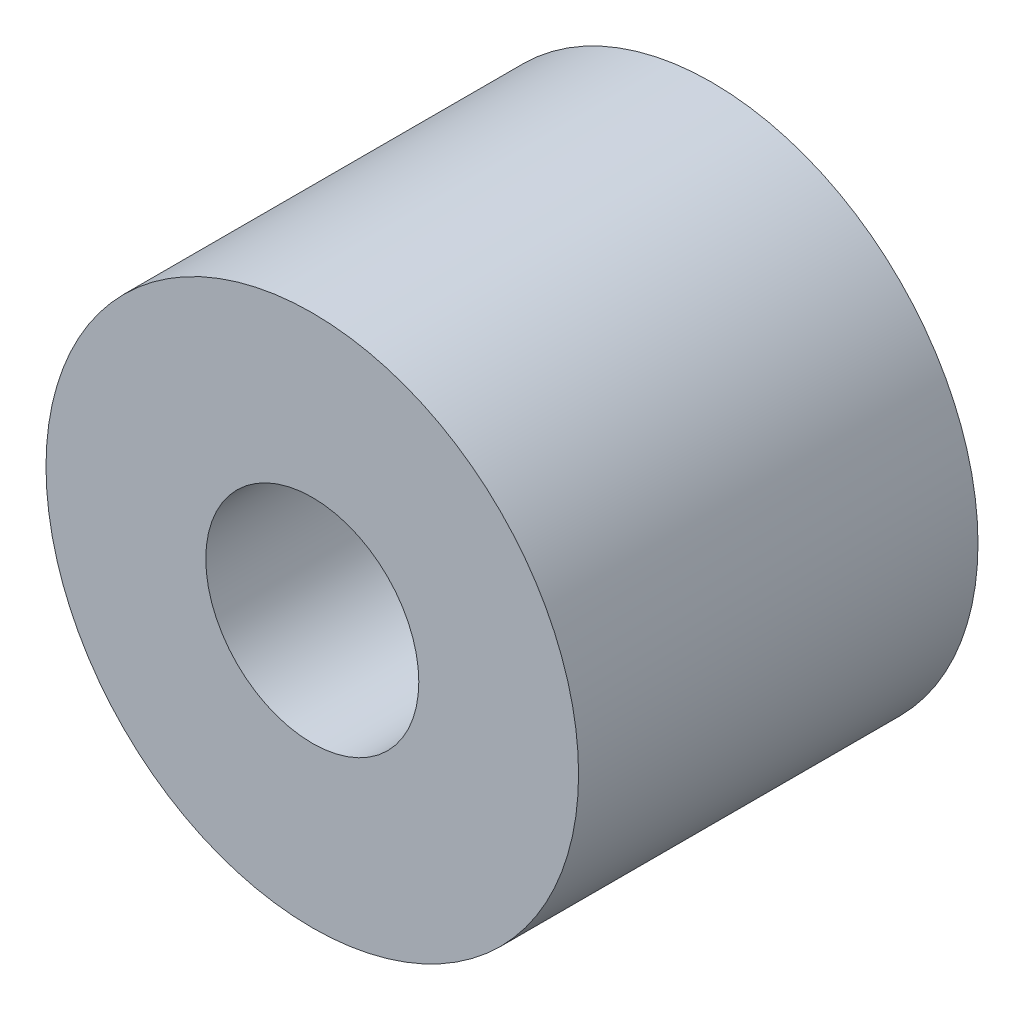
ISO-10303-21;
HEADER;
FILE_DESCRIPTION(('STEP AP214'),'2;1');
FILE_NAME('part.step','',(''),(''),'','','');
FILE_SCHEMA(('AUTOMOTIVE_DESIGN { 1 0 10303 214 1 1 1 1 }'));
ENDSEC;
DATA;
#1=APPLICATION_CONTEXT('core data for automotive mechanical design processes');
#2=APPLICATION_PROTOCOL_DEFINITION('international standard','automotive_design',2000,#1);
#3=PRODUCT_CONTEXT('',#1,'mechanical');
#4=PRODUCT('Part','Part','',(#3));
#5=PRODUCT_RELATED_PRODUCT_CATEGORY('part','',(#4));
#6=PRODUCT_DEFINITION_FORMATION('','',#4);
#7=PRODUCT_DEFINITION_CONTEXT('part definition',#1,'design');
#8=PRODUCT_DEFINITION('design','',#6,#7);
#9=PRODUCT_DEFINITION_SHAPE('','',#8);
#10=(LENGTH_UNIT() NAMED_UNIT(*) SI_UNIT(.MILLI.,.METRE.));
#11=(NAMED_UNIT(*) PLANE_ANGLE_UNIT() SI_UNIT($,.RADIAN.));
#12=(NAMED_UNIT(*) SI_UNIT($,.STERADIAN.) SOLID_ANGLE_UNIT());
#13=UNCERTAINTY_MEASURE_WITH_UNIT(LENGTH_MEASURE(1.E-05),#10,'distance_accuracy_value','');
#14=(GEOMETRIC_REPRESENTATION_CONTEXT(3) GLOBAL_UNCERTAINTY_ASSIGNED_CONTEXT((#13)) GLOBAL_UNIT_ASSIGNED_CONTEXT((#10,
#11,#12)) REPRESENTATION_CONTEXT('',''));
#15=CARTESIAN_POINT('',(0.,0.,0.));
#16=DIRECTION('',(0.,0.,1.));
#17=DIRECTION('',(1.,0.,0.));
#18=AXIS2_PLACEMENT_3D('',#15,#16,#17);
#19=CARTESIAN_POINT('',(0.,0.,15.));
#20=DIRECTION('',(0.,0.,-1.));
#21=DIRECTION('',(-1.,0.,0.));
#22=AXIS2_PLACEMENT_3D('',#19,#20,#21);
#23=CYLINDRICAL_SURFACE('',#22,10.);
#24=CARTESIAN_POINT('',(0.,0.,15.));
#25=DIRECTION('',(0.,0.,1.));
#26=DIRECTION('',(1.,0.,0.));
#27=AXIS2_PLACEMENT_3D('',#24,#25,#26);
#28=CIRCLE('',#27,10.);
#29=CARTESIAN_POINT('',(10.,0.,15.));
#30=VERTEX_POINT('',#29);
#31=EDGE_CURVE('E10',#30,#30,#28,.T.);
#32=ORIENTED_EDGE('',*,*,#31,.F.);
#33=EDGE_LOOP('',(#32));
#34=FACE_BOUND('',#33,.T.);
#35=CARTESIAN_POINT('',(0.,0.,0.));
#36=DIRECTION('',(0.,0.,1.));
#37=DIRECTION('',(1.,0.,0.));
#38=AXIS2_PLACEMENT_3D('',#35,#36,#37);
#39=CIRCLE('',#38,10.);
#40=CARTESIAN_POINT('',(10.,0.,0.));
#41=VERTEX_POINT('',#40);
#42=EDGE_CURVE('E46',#41,#41,#39,.T.);
#43=ORIENTED_EDGE('',*,*,#42,.T.);
#44=EDGE_LOOP('',(#43));
#45=FACE_BOUND('',#44,.T.);
#46=ADVANCED_FACE('F43',(#34,#45),#23,.T.);
#47=CARTESIAN_POINT('',(0.,0.,15.));
#48=DIRECTION('',(0.,0.,1.));
#49=DIRECTION('',(1.,0.,0.));
#50=AXIS2_PLACEMENT_3D('',#47,#48,#49);
#51=PLANE('',#50);
#52=CARTESIAN_POINT('',(0.,0.,15.));
#53=DIRECTION('',(0.,0.,1.));
#54=DIRECTION('',(1.,0.,0.));
#55=AXIS2_PLACEMENT_3D('',#52,#53,#54);
#56=CIRCLE('',#55,4.);
#57=CARTESIAN_POINT('',(4.,0.,15.));
#58=VERTEX_POINT('',#57);
#59=EDGE_CURVE('E55',#58,#58,#56,.T.);
#60=ORIENTED_EDGE('',*,*,#59,.F.);
#61=EDGE_LOOP('',(#60));
#62=FACE_BOUND('',#61,.T.);
#63=ORIENTED_EDGE('',*,*,#31,.T.);
#64=EDGE_LOOP('',(#63));
#65=FACE_BOUND('',#64,.T.);
#66=ADVANCED_FACE('F68',(#62,#65),#51,.T.);
#67=CARTESIAN_POINT('',(0.,0.,0.));
#68=DIRECTION('',(0.,0.,1.));
#69=DIRECTION('',(1.,0.,0.));
#70=AXIS2_PLACEMENT_3D('',#67,#68,#69);
#71=PLANE('',#70);
#72=CARTESIAN_POINT('',(0.,0.,0.));
#73=DIRECTION('',(0.,0.,1.));
#74=DIRECTION('',(1.,0.,0.));
#75=AXIS2_PLACEMENT_3D('',#72,#73,#74);
#76=CIRCLE('',#75,4.);
#77=CARTESIAN_POINT('',(4.,0.,0.));
#78=VERTEX_POINT('',#77);
#79=EDGE_CURVE('E57',#78,#78,#76,.T.);
#80=ORIENTED_EDGE('',*,*,#79,.T.);
#81=EDGE_LOOP('',(#80));
#82=FACE_BOUND('',#81,.T.);
#83=ORIENTED_EDGE('',*,*,#42,.F.);
#84=EDGE_LOOP('',(#83));
#85=FACE_BOUND('',#84,.T.);
#86=ADVANCED_FACE('F70',(#82,#85),#71,.F.);
#87=CARTESIAN_POINT('',(0.,0.,15.));
#88=DIRECTION('',(0.,0.,-1.));
#89=DIRECTION('',(-1.,0.,0.));
#90=AXIS2_PLACEMENT_3D('',#87,#88,#89);
#91=CYLINDRICAL_SURFACE('',#90,4.);
#92=ORIENTED_EDGE('',*,*,#59,.T.);
#93=EDGE_LOOP('',(#92));
#94=FACE_BOUND('',#93,.T.);
#95=ORIENTED_EDGE('',*,*,#79,.F.);
#96=EDGE_LOOP('',(#95));
#97=FACE_BOUND('',#96,.T.);
#98=ADVANCED_FACE('F65',(#94,#97),#91,.F.);
#99=CLOSED_SHELL('',(#46,#66,#86,#98));
#100=MANIFOLD_SOLID_BREP('B2',#99);
#101=ADVANCED_BREP_SHAPE_REPRESENTATION('',(#18,#100),#14);
#102=SHAPE_DEFINITION_REPRESENTATION(#9,#101);
ENDSEC;
END-ISO-10303-21;
